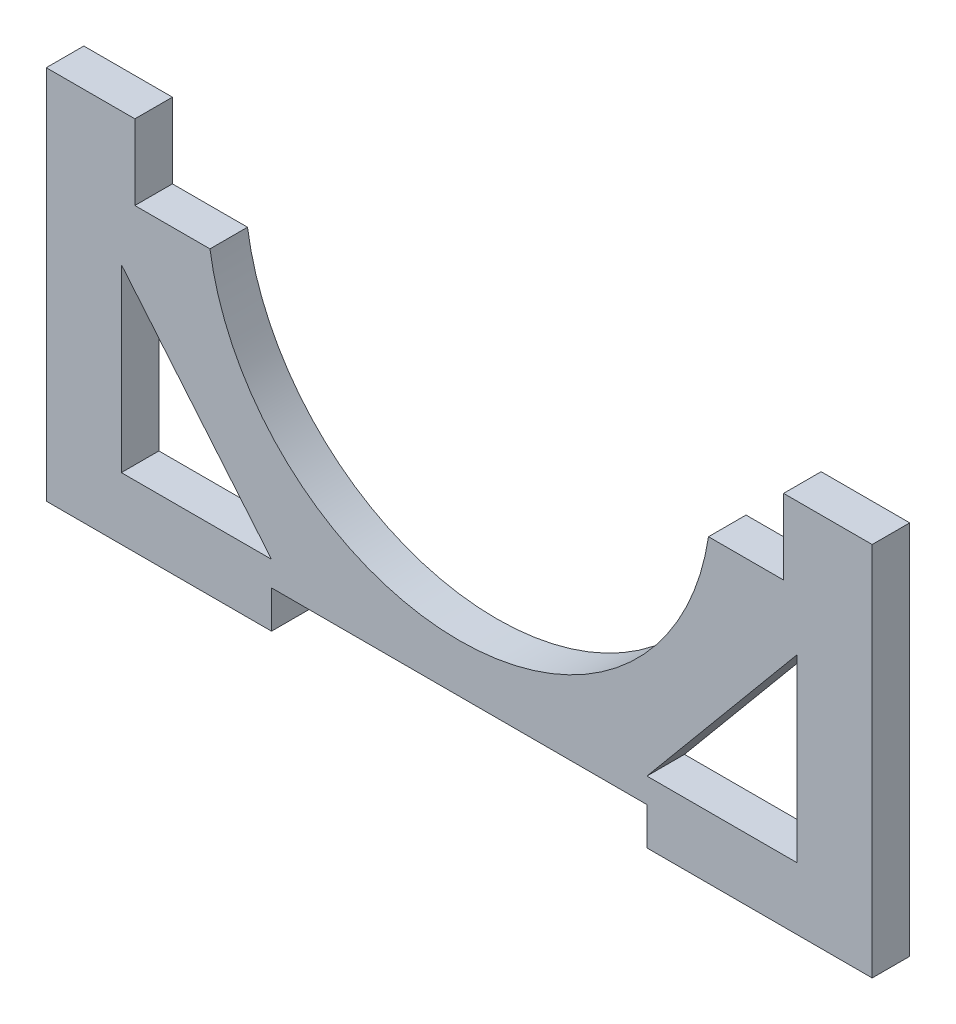
ISO-10303-21;
HEADER;
FILE_DESCRIPTION(('STEP AP214'),'2;1');
FILE_NAME('part.step','',(''),(''),'','','');
FILE_SCHEMA(('AUTOMOTIVE_DESIGN { 1 0 10303 214 1 1 1 1 }'));
ENDSEC;
DATA;
#1=APPLICATION_CONTEXT('core data for automotive mechanical design processes');
#2=APPLICATION_PROTOCOL_DEFINITION('international standard','automotive_design',2000,#1);
#3=PRODUCT_CONTEXT('',#1,'mechanical');
#4=PRODUCT('Part','Part','',(#3));
#5=PRODUCT_RELATED_PRODUCT_CATEGORY('part','',(#4));
#6=PRODUCT_DEFINITION_FORMATION('','',#4);
#7=PRODUCT_DEFINITION_CONTEXT('part definition',#1,'design');
#8=PRODUCT_DEFINITION('design','',#6,#7);
#9=PRODUCT_DEFINITION_SHAPE('','',#8);
#10=(LENGTH_UNIT() NAMED_UNIT(*) SI_UNIT(.MILLI.,.METRE.));
#11=(NAMED_UNIT(*) PLANE_ANGLE_UNIT() SI_UNIT($,.RADIAN.));
#12=(NAMED_UNIT(*) SI_UNIT($,.STERADIAN.) SOLID_ANGLE_UNIT());
#13=UNCERTAINTY_MEASURE_WITH_UNIT(LENGTH_MEASURE(1.E-05),#10,'distance_accuracy_value','');
#14=(GEOMETRIC_REPRESENTATION_CONTEXT(3) GLOBAL_UNCERTAINTY_ASSIGNED_CONTEXT((#13)) GLOBAL_UNIT_ASSIGNED_CONTEXT((#10,
#11,#12)) REPRESENTATION_CONTEXT('',''));
#15=CARTESIAN_POINT('',(0.,0.,0.));
#16=DIRECTION('',(0.,0.,1.));
#17=DIRECTION('',(1.,0.,0.));
#18=AXIS2_PLACEMENT_3D('',#15,#16,#17);
#19=CARTESIAN_POINT('',(-27.432,22.225,3.175));
#20=DIRECTION('',(0.,-1.,0.));
#21=DIRECTION('',(1.,0.,0.));
#22=AXIS2_PLACEMENT_3D('',#19,#20,#21);
#23=PLANE('',#22);
#24=DIRECTION('',(-1.,0.,0.));
#25=VECTOR('',#24,1.);
#26=CARTESIAN_POINT('',(-27.432,22.225,0.));
#27=LINE('',#26,#25);
#28=CARTESIAN_POINT('',(27.432,22.225,0.));
#29=VERTEX_POINT('',#28);
#30=CARTESIAN_POINT('',(21.082,22.225,0.));
#31=VERTEX_POINT('',#30);
#32=EDGE_CURVE('E333',#29,#31,#27,.T.);
#33=ORIENTED_EDGE('',*,*,#32,.T.);
#34=DIRECTION('',(0.,0.,1.));
#35=VECTOR('',#34,1.);
#36=CARTESIAN_POINT('',(21.082,22.225,0.));
#37=LINE('',#36,#35);
#38=CARTESIAN_POINT('',(21.082,22.225,3.175));
#39=VERTEX_POINT('',#38);
#40=EDGE_CURVE('E251',#31,#39,#37,.T.);
#41=ORIENTED_EDGE('',*,*,#40,.T.);
#42=DIRECTION('',(-1.,0.,0.));
#43=VECTOR('',#42,1.);
#44=CARTESIAN_POINT('',(-27.432,22.225,3.175));
#45=LINE('',#44,#43);
#46=CARTESIAN_POINT('',(27.432,22.225,3.175));
#47=VERTEX_POINT('',#46);
#48=EDGE_CURVE('E294',#47,#39,#45,.T.);
#49=ORIENTED_EDGE('',*,*,#48,.F.);
#50=DIRECTION('',(0.,0.,-1.));
#51=VECTOR('',#50,1.);
#52=CARTESIAN_POINT('',(27.432,22.225,3.175));
#53=LINE('',#52,#51);
#54=EDGE_CURVE('E346',#47,#29,#53,.T.);
#55=ORIENTED_EDGE('',*,*,#54,.T.);
#56=EDGE_LOOP('',(#33,#41,#49,#55));
#57=FACE_BOUND('',#56,.T.);
#58=ADVANCED_FACE('F38',(#57),#23,.F.);
#59=CARTESIAN_POINT('',(-34.925,28.575,3.175));
#60=DIRECTION('',(0.,-1.,0.));
#61=DIRECTION('',(1.,0.,0.));
#62=AXIS2_PLACEMENT_3D('',#59,#60,#61);
#63=PLANE('',#62);
#64=DIRECTION('',(-1.,0.,0.));
#65=VECTOR('',#64,1.);
#66=CARTESIAN_POINT('',(-34.925,28.575,0.));
#67=LINE('',#66,#65);
#68=CARTESIAN_POINT('',(-27.432,28.575,0.));
#69=VERTEX_POINT('',#68);
#70=CARTESIAN_POINT('',(-34.925,28.575,0.));
#71=VERTEX_POINT('',#70);
#72=EDGE_CURVE('E257',#69,#71,#67,.T.);
#73=ORIENTED_EDGE('',*,*,#72,.T.);
#74=DIRECTION('',(0.,0.,-1.));
#75=VECTOR('',#74,1.);
#76=CARTESIAN_POINT('',(-34.925,28.575,3.175));
#77=LINE('',#76,#75);
#78=CARTESIAN_POINT('',(-34.925,28.575,3.175));
#79=VERTEX_POINT('',#78);
#80=EDGE_CURVE('E11',#79,#71,#77,.T.);
#81=ORIENTED_EDGE('',*,*,#80,.F.);
#82=DIRECTION('',(-1.,0.,0.));
#83=VECTOR('',#82,1.);
#84=CARTESIAN_POINT('',(-34.925,28.575,3.175));
#85=LINE('',#84,#83);
#86=CARTESIAN_POINT('',(-27.432,28.575,3.175));
#87=VERTEX_POINT('',#86);
#88=EDGE_CURVE('E261',#87,#79,#85,.T.);
#89=ORIENTED_EDGE('',*,*,#88,.F.);
#90=DIRECTION('',(0.,0.,-1.));
#91=VECTOR('',#90,1.);
#92=CARTESIAN_POINT('',(-27.432,28.575,3.175));
#93=LINE('',#92,#91);
#94=EDGE_CURVE('E301',#87,#69,#93,.T.);
#95=ORIENTED_EDGE('',*,*,#94,.T.);
#96=EDGE_LOOP('',(#73,#81,#89,#95));
#97=FACE_BOUND('',#96,.T.);
#98=ADVANCED_FACE('F40',(#97),#63,.F.);
#99=CARTESIAN_POINT('',(-34.925,28.575,3.175));
#100=DIRECTION('',(1.,0.,0.));
#101=DIRECTION('',(0.,0.,-1.));
#102=AXIS2_PLACEMENT_3D('',#99,#100,#101);
#103=PLANE('',#102);
#104=DIRECTION('',(0.,-1.,0.));
#105=VECTOR('',#104,1.);
#106=CARTESIAN_POINT('',(-34.925,28.575,0.));
#107=LINE('',#106,#105);
#108=CARTESIAN_POINT('',(-34.925,-3.175,0.));
#109=VERTEX_POINT('',#108);
#110=EDGE_CURVE('E305',#71,#109,#107,.T.);
#111=ORIENTED_EDGE('',*,*,#110,.T.);
#112=DIRECTION('',(0.,0.,-1.));
#113=VECTOR('',#112,1.);
#114=CARTESIAN_POINT('',(-34.925,-3.175,3.175));
#115=LINE('',#114,#113);
#116=CARTESIAN_POINT('',(-34.925,-3.175,3.175));
#117=VERTEX_POINT('',#116);
#118=EDGE_CURVE('E47',#117,#109,#115,.T.);
#119=ORIENTED_EDGE('',*,*,#118,.F.);
#120=DIRECTION('',(0.,-1.,0.));
#121=VECTOR('',#120,1.);
#122=CARTESIAN_POINT('',(-34.925,28.575,3.175));
#123=LINE('',#122,#121);
#124=EDGE_CURVE('E265',#79,#117,#123,.T.);
#125=ORIENTED_EDGE('',*,*,#124,.F.);
#126=ORIENTED_EDGE('',*,*,#80,.T.);
#127=EDGE_LOOP('',(#111,#119,#125,#126));
#128=FACE_BOUND('',#127,.T.);
#129=ADVANCED_FACE('F404',(#128),#103,.F.);
#130=CARTESIAN_POINT('',(-34.925,-3.175,3.175));
#131=DIRECTION('',(0.,1.,0.));
#132=DIRECTION('',(0.,0.,1.));
#133=AXIS2_PLACEMENT_3D('',#130,#131,#132);
#134=PLANE('',#133);
#135=DIRECTION('',(1.,0.,0.));
#136=VECTOR('',#135,1.);
#137=CARTESIAN_POINT('',(-34.925,-3.175,0.));
#138=LINE('',#137,#136);
#139=CARTESIAN_POINT('',(-15.875,-3.175,0.));
#140=VERTEX_POINT('',#139);
#141=EDGE_CURVE('E308',#109,#140,#138,.T.);
#142=ORIENTED_EDGE('',*,*,#141,.T.);
#143=DIRECTION('',(0.,0.,-1.));
#144=VECTOR('',#143,1.);
#145=CARTESIAN_POINT('',(-15.875,-3.175,3.175));
#146=LINE('',#145,#144);
#147=CARTESIAN_POINT('',(-15.875,-3.175,3.175));
#148=VERTEX_POINT('',#147);
#149=EDGE_CURVE('E374',#148,#140,#146,.T.);
#150=ORIENTED_EDGE('',*,*,#149,.F.);
#151=DIRECTION('',(1.,0.,0.));
#152=VECTOR('',#151,1.);
#153=CARTESIAN_POINT('',(-34.925,-3.175,3.175));
#154=LINE('',#153,#152);
#155=EDGE_CURVE('E269',#117,#148,#154,.T.);
#156=ORIENTED_EDGE('',*,*,#155,.F.);
#157=ORIENTED_EDGE('',*,*,#118,.T.);
#158=EDGE_LOOP('',(#142,#150,#156,#157));
#159=FACE_BOUND('',#158,.T.);
#160=ADVANCED_FACE('F383',(#159),#134,.F.);
#161=CARTESIAN_POINT('',(-15.875,-3.175,3.175));
#162=DIRECTION('',(-1.,0.,0.));
#163=DIRECTION('',(0.,0.,1.));
#164=AXIS2_PLACEMENT_3D('',#161,#162,#163);
#165=PLANE('',#164);
#166=DIRECTION('',(0.,1.,0.));
#167=VECTOR('',#166,1.);
#168=CARTESIAN_POINT('',(-15.875,-3.175,0.));
#169=LINE('',#168,#167);
#170=CARTESIAN_POINT('',(-15.875,0.,0.));
#171=VERTEX_POINT('',#170);
#172=EDGE_CURVE('E311',#140,#171,#169,.T.);
#173=ORIENTED_EDGE('',*,*,#172,.T.);
#174=DIRECTION('',(0.,0.,-1.));
#175=VECTOR('',#174,1.);
#176=CARTESIAN_POINT('',(-15.875,0.,3.175));
#177=LINE('',#176,#175);
#178=CARTESIAN_POINT('',(-15.875,0.,3.175));
#179=VERTEX_POINT('',#178);
#180=EDGE_CURVE('E370',#179,#171,#177,.T.);
#181=ORIENTED_EDGE('',*,*,#180,.F.);
#182=DIRECTION('',(0.,1.,0.));
#183=VECTOR('',#182,1.);
#184=CARTESIAN_POINT('',(-15.875,-3.175,3.175));
#185=LINE('',#184,#183);
#186=EDGE_CURVE('E272',#148,#179,#185,.T.);
#187=ORIENTED_EDGE('',*,*,#186,.F.);
#188=ORIENTED_EDGE('',*,*,#149,.T.);
#189=EDGE_LOOP('',(#173,#181,#187,#188));
#190=FACE_BOUND('',#189,.T.);
#191=ADVANCED_FACE('F392',(#190),#165,.F.);
#192=CARTESIAN_POINT('',(-15.875,0.,3.175));
#193=DIRECTION('',(0.,1.,0.));
#194=DIRECTION('',(-1.,0.,0.));
#195=AXIS2_PLACEMENT_3D('',#192,#193,#194);
#196=PLANE('',#195);
#197=DIRECTION('',(1.,0.,0.));
#198=VECTOR('',#197,1.);
#199=CARTESIAN_POINT('',(-15.875,0.,0.));
#200=LINE('',#199,#198);
#201=CARTESIAN_POINT('',(15.875,0.,0.));
#202=VERTEX_POINT('',#201);
#203=EDGE_CURVE('E314',#171,#202,#200,.T.);
#204=ORIENTED_EDGE('',*,*,#203,.T.);
#205=DIRECTION('',(0.,0.,-1.));
#206=VECTOR('',#205,1.);
#207=CARTESIAN_POINT('',(15.875,0.,3.175));
#208=LINE('',#207,#206);
#209=CARTESIAN_POINT('',(15.875,0.,3.175));
#210=VERTEX_POINT('',#209);
#211=EDGE_CURVE('E366',#210,#202,#208,.T.);
#212=ORIENTED_EDGE('',*,*,#211,.F.);
#213=DIRECTION('',(1.,0.,0.));
#214=VECTOR('',#213,1.);
#215=CARTESIAN_POINT('',(-15.875,0.,3.175));
#216=LINE('',#215,#214);
#217=EDGE_CURVE('E275',#179,#210,#216,.T.);
#218=ORIENTED_EDGE('',*,*,#217,.F.);
#219=ORIENTED_EDGE('',*,*,#180,.T.);
#220=EDGE_LOOP('',(#204,#212,#218,#219));
#221=FACE_BOUND('',#220,.T.);
#222=ADVANCED_FACE('F396',(#221),#196,.F.);
#223=CARTESIAN_POINT('',(15.875,0.,3.175));
#224=DIRECTION('',(1.,0.,0.));
#225=DIRECTION('',(0.,0.,-1.));
#226=AXIS2_PLACEMENT_3D('',#223,#224,#225);
#227=PLANE('',#226);
#228=DIRECTION('',(0.,-1.,0.));
#229=VECTOR('',#228,1.);
#230=CARTESIAN_POINT('',(15.875,0.,0.));
#231=LINE('',#230,#229);
#232=CARTESIAN_POINT('',(15.875,-3.17499999999999,0.));
#233=VERTEX_POINT('',#232);
#234=EDGE_CURVE('E317',#202,#233,#231,.T.);
#235=ORIENTED_EDGE('',*,*,#234,.T.);
#236=DIRECTION('',(0.,0.,-1.));
#237=VECTOR('',#236,1.);
#238=CARTESIAN_POINT('',(15.875,-3.17499999999999,3.175));
#239=LINE('',#238,#237);
#240=CARTESIAN_POINT('',(15.875,-3.17499999999999,3.175));
#241=VERTEX_POINT('',#240);
#242=EDGE_CURVE('E362',#241,#233,#239,.T.);
#243=ORIENTED_EDGE('',*,*,#242,.F.);
#244=DIRECTION('',(0.,-1.,0.));
#245=VECTOR('',#244,1.);
#246=CARTESIAN_POINT('',(15.875,0.,3.175));
#247=LINE('',#246,#245);
#248=EDGE_CURVE('E278',#210,#241,#247,.T.);
#249=ORIENTED_EDGE('',*,*,#248,.F.);
#250=ORIENTED_EDGE('',*,*,#211,.T.);
#251=EDGE_LOOP('',(#235,#243,#249,#250));
#252=FACE_BOUND('',#251,.T.);
#253=ADVANCED_FACE('F446',(#252),#227,.F.);
#254=CARTESIAN_POINT('',(15.875,-3.17499999999999,3.175));
#255=DIRECTION('',(0.,1.,0.));
#256=DIRECTION('',(-1.,0.,0.));
#257=AXIS2_PLACEMENT_3D('',#254,#255,#256);
#258=PLANE('',#257);
#259=DIRECTION('',(1.,0.,0.));
#260=VECTOR('',#259,1.);
#261=CARTESIAN_POINT('',(15.875,-3.17499999999999,0.));
#262=LINE('',#261,#260);
#263=CARTESIAN_POINT('',(34.925,-3.17499999999999,0.));
#264=VERTEX_POINT('',#263);
#265=EDGE_CURVE('E320',#233,#264,#262,.T.);
#266=ORIENTED_EDGE('',*,*,#265,.T.);
#267=DIRECTION('',(0.,0.,-1.));
#268=VECTOR('',#267,1.);
#269=CARTESIAN_POINT('',(34.925,-3.17499999999999,3.175));
#270=LINE('',#269,#268);
#271=CARTESIAN_POINT('',(34.925,-3.17499999999999,3.175));
#272=VERTEX_POINT('',#271);
#273=EDGE_CURVE('E358',#272,#264,#270,.T.);
#274=ORIENTED_EDGE('',*,*,#273,.F.);
#275=DIRECTION('',(1.,0.,0.));
#276=VECTOR('',#275,1.);
#277=CARTESIAN_POINT('',(15.875,-3.17499999999999,3.175));
#278=LINE('',#277,#276);
#279=EDGE_CURVE('E281',#241,#272,#278,.T.);
#280=ORIENTED_EDGE('',*,*,#279,.F.);
#281=ORIENTED_EDGE('',*,*,#242,.T.);
#282=EDGE_LOOP('',(#266,#274,#280,#281));
#283=FACE_BOUND('',#282,.T.);
#284=ADVANCED_FACE('F443',(#283),#258,.F.);
#285=CARTESIAN_POINT('',(34.925,-3.17499999999999,3.175));
#286=DIRECTION('',(-1.,0.,0.));
#287=DIRECTION('',(0.,-1.,0.));
#288=AXIS2_PLACEMENT_3D('',#285,#286,#287);
#289=PLANE('',#288);
#290=DIRECTION('',(0.,1.,0.));
#291=VECTOR('',#290,1.);
#292=CARTESIAN_POINT('',(34.925,-3.17499999999999,0.));
#293=LINE('',#292,#291);
#294=CARTESIAN_POINT('',(34.925,28.575,0.));
#295=VERTEX_POINT('',#294);
#296=EDGE_CURVE('E323',#264,#295,#293,.T.);
#297=ORIENTED_EDGE('',*,*,#296,.T.);
#298=DIRECTION('',(0.,0.,-1.));
#299=VECTOR('',#298,1.);
#300=CARTESIAN_POINT('',(34.925,28.575,3.175));
#301=LINE('',#300,#299);
#302=CARTESIAN_POINT('',(34.925,28.575,3.175));
#303=VERTEX_POINT('',#302);
#304=EDGE_CURVE('E354',#303,#295,#301,.T.);
#305=ORIENTED_EDGE('',*,*,#304,.F.);
#306=DIRECTION('',(0.,1.,0.));
#307=VECTOR('',#306,1.);
#308=CARTESIAN_POINT('',(34.925,-3.17499999999999,3.175));
#309=LINE('',#308,#307);
#310=EDGE_CURVE('E284',#272,#303,#309,.T.);
#311=ORIENTED_EDGE('',*,*,#310,.F.);
#312=ORIENTED_EDGE('',*,*,#273,.T.);
#313=EDGE_LOOP('',(#297,#305,#311,#312));
#314=FACE_BOUND('',#313,.T.);
#315=ADVANCED_FACE('F439',(#314),#289,.F.);
#316=CARTESIAN_POINT('',(34.925,28.575,3.175));
#317=DIRECTION('',(0.,-1.,0.));
#318=DIRECTION('',(1.,0.,0.));
#319=AXIS2_PLACEMENT_3D('',#316,#317,#318);
#320=PLANE('',#319);
#321=DIRECTION('',(-1.,0.,0.));
#322=VECTOR('',#321,1.);
#323=CARTESIAN_POINT('',(34.925,28.575,0.));
#324=LINE('',#323,#322);
#325=CARTESIAN_POINT('',(27.432,28.575,0.));
#326=VERTEX_POINT('',#325);
#327=EDGE_CURVE('E326',#295,#326,#324,.T.);
#328=ORIENTED_EDGE('',*,*,#327,.T.);
#329=DIRECTION('',(0.,0.,-1.));
#330=VECTOR('',#329,1.);
#331=CARTESIAN_POINT('',(27.432,28.575,3.175));
#332=LINE('',#331,#330);
#333=CARTESIAN_POINT('',(27.432,28.575,3.175));
#334=VERTEX_POINT('',#333);
#335=EDGE_CURVE('E350',#334,#326,#332,.T.);
#336=ORIENTED_EDGE('',*,*,#335,.F.);
#337=DIRECTION('',(-1.,0.,0.));
#338=VECTOR('',#337,1.);
#339=CARTESIAN_POINT('',(34.925,28.575,3.175));
#340=LINE('',#339,#338);
#341=EDGE_CURVE('E287',#303,#334,#340,.T.);
#342=ORIENTED_EDGE('',*,*,#341,.F.);
#343=ORIENTED_EDGE('',*,*,#304,.T.);
#344=EDGE_LOOP('',(#328,#336,#342,#343));
#345=FACE_BOUND('',#344,.T.);
#346=ADVANCED_FACE('F435',(#345),#320,.F.);
#347=CARTESIAN_POINT('',(27.432,28.575,3.175));
#348=DIRECTION('',(1.,0.,0.));
#349=DIRECTION('',(0.,1.,0.));
#350=AXIS2_PLACEMENT_3D('',#347,#348,#349);
#351=PLANE('',#350);
#352=DIRECTION('',(0.,-1.,0.));
#353=VECTOR('',#352,1.);
#354=CARTESIAN_POINT('',(27.432,28.575,0.));
#355=LINE('',#354,#353);
#356=EDGE_CURVE('E329',#326,#29,#355,.T.);
#357=ORIENTED_EDGE('',*,*,#356,.T.);
#358=ORIENTED_EDGE('',*,*,#54,.F.);
#359=DIRECTION('',(0.,-1.,0.));
#360=VECTOR('',#359,1.);
#361=CARTESIAN_POINT('',(27.432,28.575,3.175));
#362=LINE('',#361,#360);
#363=EDGE_CURVE('E290',#334,#47,#362,.T.);
#364=ORIENTED_EDGE('',*,*,#363,.F.);
#365=ORIENTED_EDGE('',*,*,#335,.T.);
#366=EDGE_LOOP('',(#357,#358,#364,#365));
#367=FACE_BOUND('',#366,.T.);
#368=ADVANCED_FACE('F430',(#367),#351,.F.);
#369=CARTESIAN_POINT('',(-21.082,22.225,3.175));
#370=VERTEX_POINT('',#369);
#371=CARTESIAN_POINT('',(-27.432,22.225,3.175));
#372=VERTEX_POINT('',#371);
#373=EDGE_CURVE('E293',#370,#372,#45,.T.);
#374=ORIENTED_EDGE('',*,*,#373,.F.);
#375=DIRECTION('',(0.,0.,1.));
#376=VECTOR('',#375,1.);
#377=CARTESIAN_POINT('',(-21.082,22.225,0.));
#378=LINE('',#377,#376);
#379=CARTESIAN_POINT('',(-21.082,22.225,0.));
#380=VERTEX_POINT('',#379);
#381=EDGE_CURVE('E254',#380,#370,#378,.T.);
#382=ORIENTED_EDGE('',*,*,#381,.F.);
#383=CARTESIAN_POINT('',(-27.432,22.225,0.));
#384=VERTEX_POINT('',#383);
#385=EDGE_CURVE('E332',#380,#384,#27,.T.);
#386=ORIENTED_EDGE('',*,*,#385,.T.);
#387=DIRECTION('',(0.,0.,-1.));
#388=VECTOR('',#387,1.);
#389=CARTESIAN_POINT('',(-27.432,22.225,3.175));
#390=LINE('',#389,#388);
#391=EDGE_CURVE('E342',#372,#384,#390,.T.);
#392=ORIENTED_EDGE('',*,*,#391,.F.);
#393=EDGE_LOOP('',(#374,#382,#386,#392));
#394=FACE_BOUND('',#393,.T.);
#395=ADVANCED_FACE('F415',(#394),#23,.F.);
#396=CARTESIAN_POINT('',(-27.432,28.575,3.175));
#397=DIRECTION('',(-1.,0.,0.));
#398=DIRECTION('',(0.,0.,1.));
#399=AXIS2_PLACEMENT_3D('',#396,#397,#398);
#400=PLANE('',#399);
#401=DIRECTION('',(0.,1.,0.));
#402=VECTOR('',#401,1.);
#403=CARTESIAN_POINT('',(-27.432,28.575,0.));
#404=LINE('',#403,#402);
#405=EDGE_CURVE('E266',#384,#69,#404,.T.);
#406=ORIENTED_EDGE('',*,*,#405,.T.);
#407=ORIENTED_EDGE('',*,*,#94,.F.);
#408=DIRECTION('',(0.,1.,0.));
#409=VECTOR('',#408,1.);
#410=CARTESIAN_POINT('',(-27.432,28.575,3.175));
#411=LINE('',#410,#409);
#412=EDGE_CURVE('E298',#372,#87,#411,.T.);
#413=ORIENTED_EDGE('',*,*,#412,.F.);
#414=ORIENTED_EDGE('',*,*,#391,.T.);
#415=EDGE_LOOP('',(#406,#407,#413,#414));
#416=FACE_BOUND('',#415,.T.);
#417=ADVANCED_FACE('F410',(#416),#400,.F.);
#418=CARTESIAN_POINT('',(0.,0.,3.175));
#419=DIRECTION('',(0.,0.,-1.));
#420=DIRECTION('',(-1.,0.,0.));
#421=AXIS2_PLACEMENT_3D('',#418,#419,#420);
#422=PLANE('',#421);
#423=DIRECTION('',(-0.64018439966448,-0.768221279597376,0.));
#424=VECTOR('',#423,1.);
#425=CARTESIAN_POINT('',(15.875,2.09074915534302,3.175));
#426=LINE('',#425,#424);
#427=CARTESIAN_POINT('',(28.575,17.330749155343,3.175));
#428=VERTEX_POINT('',#427);
#429=CARTESIAN_POINT('',(15.875,2.09074915534302,3.175));
#430=VERTEX_POINT('',#429);
#431=EDGE_CURVE('E233',#428,#430,#426,.T.);
#432=ORIENTED_EDGE('',*,*,#431,.F.);
#433=DIRECTION('',(0.,1.,0.));
#434=VECTOR('',#433,1.);
#435=CARTESIAN_POINT('',(28.575,17.330749155343,3.175));
#436=LINE('',#435,#434);
#437=CARTESIAN_POINT('',(28.575,2.09074915534303,3.175));
#438=VERTEX_POINT('',#437);
#439=EDGE_CURVE('E54',#438,#428,#436,.T.);
#440=ORIENTED_EDGE('',*,*,#439,.F.);
#441=DIRECTION('',(1.,0.,0.));
#442=VECTOR('',#441,1.);
#443=CARTESIAN_POINT('',(28.575,2.09074915534303,3.175));
#444=LINE('',#443,#442);
#445=EDGE_CURVE('E222',#430,#438,#444,.T.);
#446=ORIENTED_EDGE('',*,*,#445,.F.);
#447=EDGE_LOOP('',(#432,#440,#446));
#448=FACE_BOUND('',#447,.T.);
#449=DIRECTION('',(0.,-1.,0.));
#450=VECTOR('',#449,1.);
#451=CARTESIAN_POINT('',(-28.575,17.330749155343,3.175));
#452=LINE('',#451,#450);
#453=CARTESIAN_POINT('',(-28.575,17.330749155343,3.175));
#454=VERTEX_POINT('',#453);
#455=CARTESIAN_POINT('',(-28.575,2.09074915534302,3.175));
#456=VERTEX_POINT('',#455);
#457=EDGE_CURVE('E201',#454,#456,#452,.T.);
#458=ORIENTED_EDGE('',*,*,#457,.F.);
#459=DIRECTION('',(-0.64018439966448,0.768221279597376,0.));
#460=VECTOR('',#459,1.);
#461=CARTESIAN_POINT('',(-15.875,2.09074915534302,3.175));
#462=LINE('',#461,#460);
#463=CARTESIAN_POINT('',(-15.875,2.09074915534302,3.175));
#464=VERTEX_POINT('',#463);
#465=EDGE_CURVE('E62',#464,#454,#462,.T.);
#466=ORIENTED_EDGE('',*,*,#465,.F.);
#467=DIRECTION('',(1.,0.,0.));
#468=VECTOR('',#467,1.);
#469=CARTESIAN_POINT('',(-28.575,2.09074915534302,3.175));
#470=LINE('',#469,#468);
#471=EDGE_CURVE('E197',#456,#464,#470,.T.);
#472=ORIENTED_EDGE('',*,*,#471,.F.);
#473=EDGE_LOOP('',(#458,#466,#472));
#474=FACE_BOUND('',#473,.T.);
#475=ORIENTED_EDGE('',*,*,#48,.T.);
#476=CARTESIAN_POINT('',(0.,25.4,3.175));
#477=DIRECTION('',(0.,0.,1.));
#478=DIRECTION('',(1.,0.,0.));
#479=AXIS2_PLACEMENT_3D('',#476,#477,#478);
#480=CIRCLE('',#479,21.3197408286311);
#481=EDGE_CURVE('E214',#370,#39,#480,.T.);
#482=ORIENTED_EDGE('',*,*,#481,.F.);
#483=ORIENTED_EDGE('',*,*,#373,.T.);
#484=ORIENTED_EDGE('',*,*,#412,.T.);
#485=ORIENTED_EDGE('',*,*,#88,.T.);
#486=ORIENTED_EDGE('',*,*,#124,.T.);
#487=ORIENTED_EDGE('',*,*,#155,.T.);
#488=ORIENTED_EDGE('',*,*,#186,.T.);
#489=ORIENTED_EDGE('',*,*,#217,.T.);
#490=ORIENTED_EDGE('',*,*,#248,.T.);
#491=ORIENTED_EDGE('',*,*,#279,.T.);
#492=ORIENTED_EDGE('',*,*,#310,.T.);
#493=ORIENTED_EDGE('',*,*,#341,.T.);
#494=ORIENTED_EDGE('',*,*,#363,.T.);
#495=EDGE_LOOP('',(#475,#482,#483,#484,#485,#486,#487,#488,#489,#490,#491,#492,#493,#494));
#496=FACE_BOUND('',#495,.T.);
#497=ADVANCED_FACE('F400',(#448,#474,#496),#422,.F.);
#498=CARTESIAN_POINT('',(0.,0.,0.));
#499=DIRECTION('',(0.,0.,-1.));
#500=DIRECTION('',(-1.,0.,0.));
#501=AXIS2_PLACEMENT_3D('',#498,#499,#500);
#502=PLANE('',#501);
#503=DIRECTION('',(0.,1.,0.));
#504=VECTOR('',#503,1.);
#505=CARTESIAN_POINT('',(28.575,17.330749155343,0.));
#506=LINE('',#505,#504);
#507=CARTESIAN_POINT('',(28.575,2.09074915534303,0.));
#508=VERTEX_POINT('',#507);
#509=CARTESIAN_POINT('',(28.575,17.330749155343,0.));
#510=VERTEX_POINT('',#509);
#511=EDGE_CURVE('E217',#508,#510,#506,.T.);
#512=ORIENTED_EDGE('',*,*,#511,.T.);
#513=DIRECTION('',(-0.64018439966448,-0.768221279597376,0.));
#514=VECTOR('',#513,1.);
#515=CARTESIAN_POINT('',(15.875,2.09074915534302,0.));
#516=LINE('',#515,#514);
#517=CARTESIAN_POINT('',(15.875,2.09074915534302,0.));
#518=VERTEX_POINT('',#517);
#519=EDGE_CURVE('E221',#510,#518,#516,.T.);
#520=ORIENTED_EDGE('',*,*,#519,.T.);
#521=DIRECTION('',(1.,0.,0.));
#522=VECTOR('',#521,1.);
#523=CARTESIAN_POINT('',(28.575,2.09074915534303,0.));
#524=LINE('',#523,#522);
#525=EDGE_CURVE('E226',#518,#508,#524,.T.);
#526=ORIENTED_EDGE('',*,*,#525,.T.);
#527=EDGE_LOOP('',(#512,#520,#526));
#528=FACE_BOUND('',#527,.T.);
#529=DIRECTION('',(-0.64018439966448,0.768221279597376,0.));
#530=VECTOR('',#529,1.);
#531=CARTESIAN_POINT('',(-15.875,2.09074915534302,0.));
#532=LINE('',#531,#530);
#533=CARTESIAN_POINT('',(-15.875,2.09074915534302,0.));
#534=VERTEX_POINT('',#533);
#535=CARTESIAN_POINT('',(-28.575,17.330749155343,0.));
#536=VERTEX_POINT('',#535);
#537=EDGE_CURVE('E178',#534,#536,#532,.T.);
#538=ORIENTED_EDGE('',*,*,#537,.T.);
#539=DIRECTION('',(0.,-1.,0.));
#540=VECTOR('',#539,1.);
#541=CARTESIAN_POINT('',(-28.575,17.330749155343,0.));
#542=LINE('',#541,#540);
#543=CARTESIAN_POINT('',(-28.575,2.09074915534302,0.));
#544=VERTEX_POINT('',#543);
#545=EDGE_CURVE('E189',#536,#544,#542,.T.);
#546=ORIENTED_EDGE('',*,*,#545,.T.);
#547=DIRECTION('',(1.,0.,0.));
#548=VECTOR('',#547,1.);
#549=CARTESIAN_POINT('',(-28.575,2.09074915534302,0.));
#550=LINE('',#549,#548);
#551=EDGE_CURVE('E185',#544,#534,#550,.T.);
#552=ORIENTED_EDGE('',*,*,#551,.T.);
#553=EDGE_LOOP('',(#538,#546,#552));
#554=FACE_BOUND('',#553,.T.);
#555=CARTESIAN_POINT('',(0.,25.4,0.));
#556=DIRECTION('',(0.,0.,1.));
#557=DIRECTION('',(1.,0.,0.));
#558=AXIS2_PLACEMENT_3D('',#555,#556,#557);
#559=CIRCLE('',#558,21.3197408286311);
#560=EDGE_CURVE('E247',#380,#31,#559,.T.);
#561=ORIENTED_EDGE('',*,*,#560,.T.);
#562=ORIENTED_EDGE('',*,*,#32,.F.);
#563=ORIENTED_EDGE('',*,*,#356,.F.);
#564=ORIENTED_EDGE('',*,*,#327,.F.);
#565=ORIENTED_EDGE('',*,*,#296,.F.);
#566=ORIENTED_EDGE('',*,*,#265,.F.);
#567=ORIENTED_EDGE('',*,*,#234,.F.);
#568=ORIENTED_EDGE('',*,*,#203,.F.);
#569=ORIENTED_EDGE('',*,*,#172,.F.);
#570=ORIENTED_EDGE('',*,*,#141,.F.);
#571=ORIENTED_EDGE('',*,*,#110,.F.);
#572=ORIENTED_EDGE('',*,*,#72,.F.);
#573=ORIENTED_EDGE('',*,*,#405,.F.);
#574=ORIENTED_EDGE('',*,*,#385,.F.);
#575=EDGE_LOOP('',(#561,#562,#563,#564,#565,#566,#567,#568,#569,#570,#571,#572,#573,#574));
#576=FACE_BOUND('',#575,.T.);
#577=ADVANCED_FACE('F194',(#528,#554,#576),#502,.T.);
#578=CARTESIAN_POINT('',(0.,25.4,0.));
#579=DIRECTION('',(0.,0.,1.));
#580=DIRECTION('',(1.,0.,0.));
#581=AXIS2_PLACEMENT_3D('',#578,#579,#580);
#582=CYLINDRICAL_SURFACE('',#581,21.3197408286311);
#583=ORIENTED_EDGE('',*,*,#481,.T.);
#584=ORIENTED_EDGE('',*,*,#40,.F.);
#585=ORIENTED_EDGE('',*,*,#560,.F.);
#586=ORIENTED_EDGE('',*,*,#381,.T.);
#587=EDGE_LOOP('',(#583,#584,#585,#586));
#588=FACE_BOUND('',#587,.T.);
#589=ADVANCED_FACE('F422',(#588),#582,.F.);
#590=CARTESIAN_POINT('',(-15.875,2.09074915534302,0.));
#591=DIRECTION('',(0.768221279597376,0.64018439966448,0.));
#592=DIRECTION('',(-0.64018439966448,0.768221279597376,0.));
#593=AXIS2_PLACEMENT_3D('',#590,#591,#592);
#594=PLANE('',#593);
#595=ORIENTED_EDGE('',*,*,#465,.T.);
#596=DIRECTION('',(0.,0.,1.));
#597=VECTOR('',#596,1.);
#598=CARTESIAN_POINT('',(-28.575,17.330749155343,0.));
#599=LINE('',#598,#597);
#600=EDGE_CURVE('E174',#536,#454,#599,.T.);
#601=ORIENTED_EDGE('',*,*,#600,.F.);
#602=ORIENTED_EDGE('',*,*,#537,.F.);
#603=DIRECTION('',(0.,0.,1.));
#604=VECTOR('',#603,1.);
#605=CARTESIAN_POINT('',(-15.875,2.09074915534302,0.));
#606=LINE('',#605,#604);
#607=EDGE_CURVE('E211',#534,#464,#606,.T.);
#608=ORIENTED_EDGE('',*,*,#607,.T.);
#609=EDGE_LOOP('',(#595,#601,#602,#608));
#610=FACE_BOUND('',#609,.T.);
#611=ADVANCED_FACE('F176',(#610),#594,.F.);
#612=CARTESIAN_POINT('',(-28.575,2.09074915534302,0.));
#613=DIRECTION('',(0.,-1.,0.));
#614=DIRECTION('',(0.,0.,-1.));
#615=AXIS2_PLACEMENT_3D('',#612,#613,#614);
#616=PLANE('',#615);
#617=ORIENTED_EDGE('',*,*,#471,.T.);
#618=ORIENTED_EDGE('',*,*,#607,.F.);
#619=ORIENTED_EDGE('',*,*,#551,.F.);
#620=DIRECTION('',(0.,0.,1.));
#621=VECTOR('',#620,1.);
#622=CARTESIAN_POINT('',(-28.575,2.09074915534302,0.));
#623=LINE('',#622,#621);
#624=EDGE_CURVE('E184',#544,#456,#623,.T.);
#625=ORIENTED_EDGE('',*,*,#624,.T.);
#626=EDGE_LOOP('',(#617,#618,#619,#625));
#627=FACE_BOUND('',#626,.T.);
#628=ADVANCED_FACE('F529',(#627),#616,.F.);
#629=CARTESIAN_POINT('',(-28.575,17.330749155343,0.));
#630=DIRECTION('',(-1.,0.,0.));
#631=DIRECTION('',(0.,-1.,0.));
#632=AXIS2_PLACEMENT_3D('',#629,#630,#631);
#633=PLANE('',#632);
#634=ORIENTED_EDGE('',*,*,#457,.T.);
#635=ORIENTED_EDGE('',*,*,#624,.F.);
#636=ORIENTED_EDGE('',*,*,#545,.F.);
#637=ORIENTED_EDGE('',*,*,#600,.T.);
#638=EDGE_LOOP('',(#634,#635,#636,#637));
#639=FACE_BOUND('',#638,.T.);
#640=ADVANCED_FACE('F190',(#639),#633,.F.);
#641=CARTESIAN_POINT('',(28.575,17.330749155343,0.));
#642=DIRECTION('',(1.,0.,0.));
#643=DIRECTION('',(0.,1.,0.));
#644=AXIS2_PLACEMENT_3D('',#641,#642,#643);
#645=PLANE('',#644);
#646=ORIENTED_EDGE('',*,*,#439,.T.);
#647=DIRECTION('',(0.,0.,1.));
#648=VECTOR('',#647,1.);
#649=CARTESIAN_POINT('',(28.575,17.330749155343,0.));
#650=LINE('',#649,#648);
#651=EDGE_CURVE('E230',#510,#428,#650,.T.);
#652=ORIENTED_EDGE('',*,*,#651,.F.);
#653=ORIENTED_EDGE('',*,*,#511,.F.);
#654=DIRECTION('',(0.,0.,1.));
#655=VECTOR('',#654,1.);
#656=CARTESIAN_POINT('',(28.575,2.09074915534303,0.));
#657=LINE('',#656,#655);
#658=EDGE_CURVE('E208',#508,#438,#657,.T.);
#659=ORIENTED_EDGE('',*,*,#658,.T.);
#660=EDGE_LOOP('',(#646,#652,#653,#659));
#661=FACE_BOUND('',#660,.T.);
#662=ADVANCED_FACE('F543',(#661),#645,.F.);
#663=CARTESIAN_POINT('',(28.575,2.09074915534303,0.));
#664=DIRECTION('',(0.,-1.,0.));
#665=DIRECTION('',(1.,0.,0.));
#666=AXIS2_PLACEMENT_3D('',#663,#664,#665);
#667=PLANE('',#666);
#668=ORIENTED_EDGE('',*,*,#445,.T.);
#669=ORIENTED_EDGE('',*,*,#658,.F.);
#670=ORIENTED_EDGE('',*,*,#525,.F.);
#671=DIRECTION('',(0.,0.,1.));
#672=VECTOR('',#671,1.);
#673=CARTESIAN_POINT('',(15.875,2.09074915534302,0.));
#674=LINE('',#673,#672);
#675=EDGE_CURVE('E242',#518,#430,#674,.T.);
#676=ORIENTED_EDGE('',*,*,#675,.T.);
#677=EDGE_LOOP('',(#668,#669,#670,#676));
#678=FACE_BOUND('',#677,.T.);
#679=ADVANCED_FACE('F550',(#678),#667,.F.);
#680=CARTESIAN_POINT('',(15.875,2.09074915534302,0.));
#681=DIRECTION('',(-0.768221279597376,0.64018439966448,0.));
#682=DIRECTION('',(-0.64018439966448,-0.768221279597376,0.));
#683=AXIS2_PLACEMENT_3D('',#680,#681,#682);
#684=PLANE('',#683);
#685=ORIENTED_EDGE('',*,*,#431,.T.);
#686=ORIENTED_EDGE('',*,*,#675,.F.);
#687=ORIENTED_EDGE('',*,*,#519,.F.);
#688=ORIENTED_EDGE('',*,*,#651,.T.);
#689=EDGE_LOOP('',(#685,#686,#687,#688));
#690=FACE_BOUND('',#689,.T.);
#691=ADVANCED_FACE('F557',(#690),#684,.F.);
#692=CLOSED_SHELL('',(#58,#98,#129,#160,#191,#222,#253,#284,#315,#346,#368,#395,#417,#497,#577,
#589,#611,#628,#640,#662,#679,#691));
#693=MANIFOLD_SOLID_BREP('B2',#692);
#694=ADVANCED_BREP_SHAPE_REPRESENTATION('',(#18,#693),#14);
#695=SHAPE_DEFINITION_REPRESENTATION(#9,#694);
ENDSEC;
END-ISO-10303-21;
